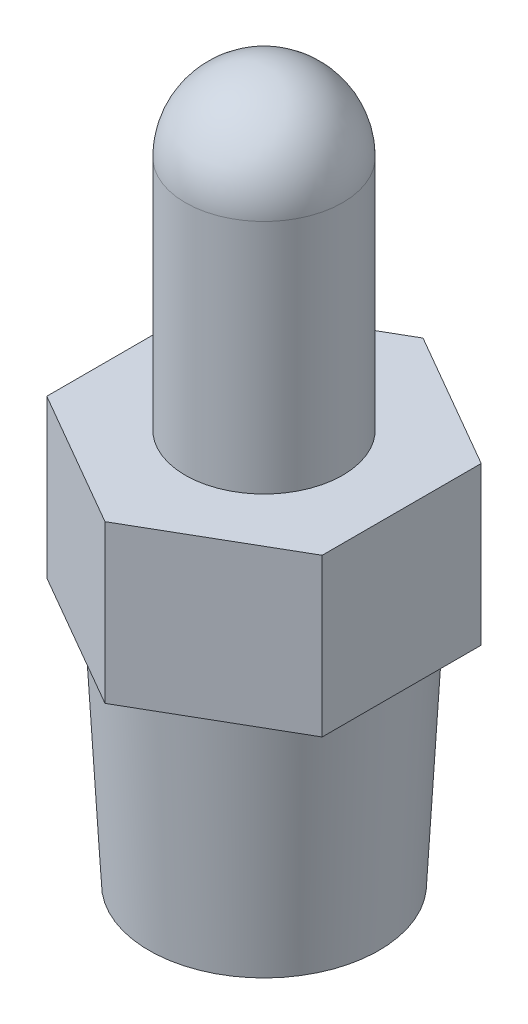
ISO-10303-21;
HEADER;
FILE_DESCRIPTION(('STEP AP214'),'2;1');
FILE_NAME('part.step','',(''),(''),'','','');
FILE_SCHEMA(('AUTOMOTIVE_DESIGN { 1 0 10303 214 1 1 1 1 }'));
ENDSEC;
DATA;
#1=APPLICATION_CONTEXT('core data for automotive mechanical design processes');
#2=APPLICATION_PROTOCOL_DEFINITION('international standard','automotive_design',2000,#1);
#3=PRODUCT_CONTEXT('',#1,'mechanical');
#4=PRODUCT('Part','Part','',(#3));
#5=PRODUCT_RELATED_PRODUCT_CATEGORY('part','',(#4));
#6=PRODUCT_DEFINITION_FORMATION('','',#4);
#7=PRODUCT_DEFINITION_CONTEXT('part definition',#1,'design');
#8=PRODUCT_DEFINITION('design','',#6,#7);
#9=PRODUCT_DEFINITION_SHAPE('','',#8);
#10=(LENGTH_UNIT() NAMED_UNIT(*) SI_UNIT(.MILLI.,.METRE.));
#11=(NAMED_UNIT(*) PLANE_ANGLE_UNIT() SI_UNIT($,.RADIAN.));
#12=(NAMED_UNIT(*) SI_UNIT($,.STERADIAN.) SOLID_ANGLE_UNIT());
#13=UNCERTAINTY_MEASURE_WITH_UNIT(LENGTH_MEASURE(1.E-05),#10,'distance_accuracy_value','');
#14=(GEOMETRIC_REPRESENTATION_CONTEXT(3) GLOBAL_UNCERTAINTY_ASSIGNED_CONTEXT((#13)) GLOBAL_UNIT_ASSIGNED_CONTEXT((#10,
#11,#12)) REPRESENTATION_CONTEXT('',''));
#15=CARTESIAN_POINT('',(0.,0.,0.));
#16=DIRECTION('',(0.,0.,1.));
#17=DIRECTION('',(1.,0.,0.));
#18=AXIS2_PLACEMENT_3D('',#15,#16,#17);
#19=CARTESIAN_POINT('',(5.55625,6.35,3.20790243318486));
#20=DIRECTION('',(-1.,0.,0.));
#21=DIRECTION('',(0.,0.,1.));
#22=AXIS2_PLACEMENT_3D('',#19,#20,#21);
#23=PLANE('',#22);
#24=DIRECTION('',(0.,0.,-1.));
#25=VECTOR('',#24,1.);
#26=CARTESIAN_POINT('',(5.55625,0.,3.20790243318486));
#27=LINE('',#26,#25);
#28=CARTESIAN_POINT('',(5.55625,0.,3.20790243318486));
#29=VERTEX_POINT('',#28);
#30=CARTESIAN_POINT('',(5.55625,0.,-3.20790243318486));
#31=VERTEX_POINT('',#30);
#32=EDGE_CURVE('E119',#29,#31,#27,.T.);
#33=ORIENTED_EDGE('',*,*,#32,.T.);
#34=DIRECTION('',(0.,-1.,0.));
#35=VECTOR('',#34,1.);
#36=CARTESIAN_POINT('',(5.55625,6.35,-3.20790243318486));
#37=LINE('',#36,#35);
#38=CARTESIAN_POINT('',(5.55625,6.35,-3.20790243318486));
#39=VERTEX_POINT('',#38);
#40=EDGE_CURVE('E137',#39,#31,#37,.T.);
#41=ORIENTED_EDGE('',*,*,#40,.F.);
#42=DIRECTION('',(0.,0.,-1.));
#43=VECTOR('',#42,1.);
#44=CARTESIAN_POINT('',(5.55625,6.35,3.20790243318486));
#45=LINE('',#44,#43);
#46=CARTESIAN_POINT('',(5.55625,6.35,3.20790243318486));
#47=VERTEX_POINT('',#46);
#48=EDGE_CURVE('E130',#47,#39,#45,.T.);
#49=ORIENTED_EDGE('',*,*,#48,.F.);
#50=DIRECTION('',(0.,-1.,0.));
#51=VECTOR('',#50,1.);
#52=CARTESIAN_POINT('',(5.55625,6.35,3.20790243318486));
#53=LINE('',#52,#51);
#54=EDGE_CURVE('E115',#47,#29,#53,.T.);
#55=ORIENTED_EDGE('',*,*,#54,.T.);
#56=EDGE_LOOP('',(#33,#41,#49,#55));
#57=FACE_BOUND('',#56,.T.);
#58=ADVANCED_FACE('F33',(#57),#23,.F.);
#59=CARTESIAN_POINT('',(5.55625,6.35,-3.20790243318486));
#60=DIRECTION('',(-0.5,0.,0.866025403784439));
#61=DIRECTION('',(0.866025403784439,0.,0.5));
#62=AXIS2_PLACEMENT_3D('',#59,#60,#61);
#63=PLANE('',#62);
#64=DIRECTION('',(-0.866025403784439,0.,-0.5));
#65=VECTOR('',#64,1.);
#66=CARTESIAN_POINT('',(5.55625,0.,-3.20790243318486));
#67=LINE('',#66,#65);
#68=CARTESIAN_POINT('',(0.,0.,-6.41580486636972));
#69=VERTEX_POINT('',#68);
#70=EDGE_CURVE('E122',#31,#69,#67,.T.);
#71=ORIENTED_EDGE('',*,*,#70,.T.);
#72=DIRECTION('',(0.,-1.,0.));
#73=VECTOR('',#72,1.);
#74=CARTESIAN_POINT('',(0.,6.35,-6.41580486636972));
#75=LINE('',#74,#73);
#76=CARTESIAN_POINT('',(0.,6.35,-6.41580486636972));
#77=VERTEX_POINT('',#76);
#78=EDGE_CURVE('E134',#77,#69,#75,.T.);
#79=ORIENTED_EDGE('',*,*,#78,.F.);
#80=DIRECTION('',(-0.866025403784439,0.,-0.5));
#81=VECTOR('',#80,1.);
#82=CARTESIAN_POINT('',(5.55625,6.35,-3.20790243318486));
#83=LINE('',#82,#81);
#84=EDGE_CURVE('E88',#39,#77,#83,.T.);
#85=ORIENTED_EDGE('',*,*,#84,.F.);
#86=ORIENTED_EDGE('',*,*,#40,.T.);
#87=EDGE_LOOP('',(#71,#79,#85,#86));
#88=FACE_BOUND('',#87,.T.);
#89=ADVANCED_FACE('F156',(#88),#63,.F.);
#90=CARTESIAN_POINT('',(0.,6.35,-6.41580486636972));
#91=DIRECTION('',(0.5,0.,0.866025403784439));
#92=DIRECTION('',(0.866025403784439,0.,-0.5));
#93=AXIS2_PLACEMENT_3D('',#90,#91,#92);
#94=PLANE('',#93);
#95=DIRECTION('',(-0.866025403784439,0.,0.5));
#96=VECTOR('',#95,1.);
#97=CARTESIAN_POINT('',(0.,0.,-6.41580486636972));
#98=LINE('',#97,#96);
#99=CARTESIAN_POINT('',(-5.55625,0.,-3.20790243318486));
#100=VERTEX_POINT('',#99);
#101=EDGE_CURVE('E125',#69,#100,#98,.T.);
#102=ORIENTED_EDGE('',*,*,#101,.T.);
#103=DIRECTION('',(0.,-1.,0.));
#104=VECTOR('',#103,1.);
#105=CARTESIAN_POINT('',(-5.55625,6.35,-3.20790243318486));
#106=LINE('',#105,#104);
#107=CARTESIAN_POINT('',(-5.55625,6.35,-3.20790243318486));
#108=VERTEX_POINT('',#107);
#109=EDGE_CURVE('E110',#108,#100,#106,.T.);
#110=ORIENTED_EDGE('',*,*,#109,.F.);
#111=DIRECTION('',(-0.866025403784439,0.,0.5));
#112=VECTOR('',#111,1.);
#113=CARTESIAN_POINT('',(0.,6.35,-6.41580486636972));
#114=LINE('',#113,#112);
#115=EDGE_CURVE('E101',#77,#108,#114,.T.);
#116=ORIENTED_EDGE('',*,*,#115,.F.);
#117=ORIENTED_EDGE('',*,*,#78,.T.);
#118=EDGE_LOOP('',(#102,#110,#116,#117));
#119=FACE_BOUND('',#118,.T.);
#120=ADVANCED_FACE('F161',(#119),#94,.F.);
#121=CARTESIAN_POINT('',(-5.55625,6.35,-3.20790243318486));
#122=DIRECTION('',(1.,0.,0.));
#123=DIRECTION('',(0.,0.,-1.));
#124=AXIS2_PLACEMENT_3D('',#121,#122,#123);
#125=PLANE('',#124);
#126=DIRECTION('',(0.,0.,1.));
#127=VECTOR('',#126,1.);
#128=CARTESIAN_POINT('',(-5.55625,0.,-3.20790243318486));
#129=LINE('',#128,#127);
#130=CARTESIAN_POINT('',(-5.55625,0.,3.20790243318486));
#131=VERTEX_POINT('',#130);
#132=EDGE_CURVE('E109',#100,#131,#129,.T.);
#133=ORIENTED_EDGE('',*,*,#132,.T.);
#134=DIRECTION('',(0.,-1.,0.));
#135=VECTOR('',#134,1.);
#136=CARTESIAN_POINT('',(-5.55625,6.35,3.20790243318486));
#137=LINE('',#136,#135);
#138=CARTESIAN_POINT('',(-5.55625,6.35,3.20790243318486));
#139=VERTEX_POINT('',#138);
#140=EDGE_CURVE('E106',#139,#131,#137,.T.);
#141=ORIENTED_EDGE('',*,*,#140,.F.);
#142=DIRECTION('',(0.,0.,1.));
#143=VECTOR('',#142,1.);
#144=CARTESIAN_POINT('',(-5.55625,6.35,-3.20790243318486));
#145=LINE('',#144,#143);
#146=EDGE_CURVE('E95',#108,#139,#145,.T.);
#147=ORIENTED_EDGE('',*,*,#146,.F.);
#148=ORIENTED_EDGE('',*,*,#109,.T.);
#149=EDGE_LOOP('',(#133,#141,#147,#148));
#150=FACE_BOUND('',#149,.T.);
#151=ADVANCED_FACE('F107',(#150),#125,.F.);
#152=CARTESIAN_POINT('',(-5.55625,6.35,3.20790243318486));
#153=DIRECTION('',(0.5,0.,-0.866025403784439));
#154=DIRECTION('',(-0.866025403784439,0.,-0.5));
#155=AXIS2_PLACEMENT_3D('',#152,#153,#154);
#156=PLANE('',#155);
#157=DIRECTION('',(0.866025403784439,0.,0.5));
#158=VECTOR('',#157,1.);
#159=CARTESIAN_POINT('',(-5.55625,0.,3.20790243318486));
#160=LINE('',#159,#158);
#161=CARTESIAN_POINT('',(0.,0.,6.41580486636972));
#162=VERTEX_POINT('',#161);
#163=EDGE_CURVE('E73',#131,#162,#160,.T.);
#164=ORIENTED_EDGE('',*,*,#163,.T.);
#165=DIRECTION('',(0.,-1.,0.));
#166=VECTOR('',#165,1.);
#167=CARTESIAN_POINT('',(0.,6.35,6.41580486636972));
#168=LINE('',#167,#166);
#169=CARTESIAN_POINT('',(0.,6.35,6.41580486636972));
#170=VERTEX_POINT('',#169);
#171=EDGE_CURVE('E111',#170,#162,#168,.T.);
#172=ORIENTED_EDGE('',*,*,#171,.F.);
#173=DIRECTION('',(0.866025403784439,0.,0.5));
#174=VECTOR('',#173,1.);
#175=CARTESIAN_POINT('',(-5.55625,6.35,3.20790243318486));
#176=LINE('',#175,#174);
#177=EDGE_CURVE('E99',#139,#170,#176,.T.);
#178=ORIENTED_EDGE('',*,*,#177,.F.);
#179=ORIENTED_EDGE('',*,*,#140,.T.);
#180=EDGE_LOOP('',(#164,#172,#178,#179));
#181=FACE_BOUND('',#180,.T.);
#182=ADVANCED_FACE('F113',(#181),#156,.F.);
#183=CARTESIAN_POINT('',(0.,6.35,6.41580486636972));
#184=DIRECTION('',(-0.5,0.,-0.866025403784438));
#185=DIRECTION('',(-0.866025403784439,0.,0.5));
#186=AXIS2_PLACEMENT_3D('',#183,#184,#185);
#187=PLANE('',#186);
#188=DIRECTION('',(0.866025403784438,0.,-0.5));
#189=VECTOR('',#188,1.);
#190=CARTESIAN_POINT('',(0.,0.,6.41580486636972));
#191=LINE('',#190,#189);
#192=EDGE_CURVE('E79',#162,#29,#191,.T.);
#193=ORIENTED_EDGE('',*,*,#192,.T.);
#194=ORIENTED_EDGE('',*,*,#54,.F.);
#195=DIRECTION('',(0.866025403784438,0.,-0.5));
#196=VECTOR('',#195,1.);
#197=CARTESIAN_POINT('',(0.,6.35,6.41580486636972));
#198=LINE('',#197,#196);
#199=EDGE_CURVE('E50',#170,#47,#198,.T.);
#200=ORIENTED_EDGE('',*,*,#199,.F.);
#201=ORIENTED_EDGE('',*,*,#171,.T.);
#202=EDGE_LOOP('',(#193,#194,#200,#201));
#203=FACE_BOUND('',#202,.T.);
#204=ADVANCED_FACE('F171',(#203),#187,.F.);
#205=CARTESIAN_POINT('',(0.,6.35,0.));
#206=DIRECTION('',(0.,1.,0.));
#207=DIRECTION('',(0.,0.,1.));
#208=AXIS2_PLACEMENT_3D('',#205,#206,#207);
#209=PLANE('',#208);
#210=CARTESIAN_POINT('',(0.,6.35,0.));
#211=DIRECTION('',(0.,1.,0.));
#212=DIRECTION('',(0.,0.,1.));
#213=AXIS2_PLACEMENT_3D('',#210,#211,#212);
#214=CIRCLE('',#213,3.175);
#215=CARTESIAN_POINT('',(0.,6.35,3.175));
#216=VERTEX_POINT('',#215);
#217=EDGE_CURVE('E123',#216,#216,#214,.T.);
#218=ORIENTED_EDGE('',*,*,#217,.F.);
#219=EDGE_LOOP('',(#218));
#220=FACE_BOUND('',#219,.T.);
#221=ORIENTED_EDGE('',*,*,#48,.T.);
#222=ORIENTED_EDGE('',*,*,#84,.T.);
#223=ORIENTED_EDGE('',*,*,#115,.T.);
#224=ORIENTED_EDGE('',*,*,#146,.T.);
#225=ORIENTED_EDGE('',*,*,#177,.T.);
#226=ORIENTED_EDGE('',*,*,#199,.T.);
#227=EDGE_LOOP('',(#221,#222,#223,#224,#225,#226));
#228=FACE_BOUND('',#227,.T.);
#229=ADVANCED_FACE('F97',(#220,#228),#209,.T.);
#230=CARTESIAN_POINT('',(0.,0.,0.));
#231=DIRECTION('',(0.,1.,0.));
#232=DIRECTION('',(0.,0.,1.));
#233=AXIS2_PLACEMENT_3D('',#230,#231,#232);
#234=PLANE('',#233);
#235=CARTESIAN_POINT('',(0.,0.,0.));
#236=DIRECTION('',(0.,1.,0.));
#237=DIRECTION('',(0.,0.,1.));
#238=AXIS2_PLACEMENT_3D('',#235,#236,#237);
#239=CIRCLE('',#238,5.13675364126955);
#240=CARTESIAN_POINT('',(0.,0.,5.13675364126955));
#241=VERTEX_POINT('',#240);
#242=EDGE_CURVE('E11',#241,#241,#239,.F.);
#243=ORIENTED_EDGE('',*,*,#242,.F.);
#244=EDGE_LOOP('',(#243));
#245=FACE_BOUND('',#244,.T.);
#246=ORIENTED_EDGE('',*,*,#32,.F.);
#247=ORIENTED_EDGE('',*,*,#192,.F.);
#248=ORIENTED_EDGE('',*,*,#163,.F.);
#249=ORIENTED_EDGE('',*,*,#132,.F.);
#250=ORIENTED_EDGE('',*,*,#101,.F.);
#251=ORIENTED_EDGE('',*,*,#70,.F.);
#252=EDGE_LOOP('',(#246,#247,#248,#249,#250,#251));
#253=FACE_BOUND('',#252,.T.);
#254=ADVANCED_FACE('F153',(#245,#253),#234,.F.);
#255=CARTESIAN_POINT('',(0.,19.05,0.));
#256=DIRECTION('',(0.,-1.,0.));
#257=DIRECTION('',(0.,0.,-1.));
#258=AXIS2_PLACEMENT_3D('',#255,#256,#257);
#259=CYLINDRICAL_SURFACE('',#258,3.175);
#260=CARTESIAN_POINT('',(0.,15.875,0.));
#261=DIRECTION('',(0.,-1.,0.));
#262=DIRECTION('',(0.,0.,-1.));
#263=AXIS2_PLACEMENT_3D('',#260,#261,#262);
#264=CIRCLE('',#263,3.175);
#265=CARTESIAN_POINT('',(0.,15.875,-3.175));
#266=VERTEX_POINT('',#265);
#267=EDGE_CURVE('E42',#266,#266,#264,.T.);
#268=ORIENTED_EDGE('',*,*,#267,.T.);
#269=EDGE_LOOP('',(#268));
#270=FACE_BOUND('',#269,.T.);
#271=ORIENTED_EDGE('',*,*,#217,.T.);
#272=EDGE_LOOP('',(#271));
#273=FACE_BOUND('',#272,.T.);
#274=ADVANCED_FACE('F141',(#270,#273),#259,.T.);
#275=CARTESIAN_POINT('',(0.,15.875,0.));
#276=DIRECTION('',(0.,1.,0.));
#277=DIRECTION('',(0.,0.,1.));
#278=AXIS2_PLACEMENT_3D('',#275,#276,#277);
#279=SPHERICAL_SURFACE('',#278,3.175);
#280=ORIENTED_EDGE('',*,*,#267,.F.);
#281=EDGE_LOOP('',(#280));
#282=FACE_BOUND('',#281,.T.);
#283=ADVANCED_FACE('F35',(#282),#279,.T.);
#284=CARTESIAN_POINT('',(0.,0.,0.));
#285=DIRECTION('',(0.,1.,0.));
#286=DIRECTION('',(0.,0.,-1.));
#287=AXIS2_PLACEMENT_3D('',#284,#285,#286);
#288=CONICAL_SURFACE('',#287,5.13675364126955,0.0523598775598299);
#289=CARTESIAN_POINT('',(0.,-9.525,0.));
#290=DIRECTION('',(0.,-1.,0.));
#291=DIRECTION('',(0.,0.,-1.));
#292=AXIS2_PLACEMENT_3D('',#289,#290,#291);
#293=CIRCLE('',#292,4.63756954359859);
#294=CARTESIAN_POINT('',(0.,-9.525,-4.63756954359859));
#295=VERTEX_POINT('',#294);
#296=EDGE_CURVE('E186',#295,#295,#293,.T.);
#297=ORIENTED_EDGE('',*,*,#296,.F.);
#298=EDGE_LOOP('',(#297));
#299=FACE_BOUND('',#298,.T.);
#300=ORIENTED_EDGE('',*,*,#242,.T.);
#301=EDGE_LOOP('',(#300));
#302=FACE_BOUND('',#301,.T.);
#303=ADVANCED_FACE('F145',(#299,#302),#288,.T.);
#304=CARTESIAN_POINT('',(0.,-9.525,0.));
#305=DIRECTION('',(0.,-1.,0.));
#306=DIRECTION('',(0.,0.,-1.));
#307=AXIS2_PLACEMENT_3D('',#304,#305,#306);
#308=PLANE('',#307);
#309=ORIENTED_EDGE('',*,*,#296,.T.);
#310=EDGE_LOOP('',(#309));
#311=FACE_BOUND('',#310,.T.);
#312=ADVANCED_FACE('F150',(#311),#308,.T.);
#313=CLOSED_SHELL('',(#58,#89,#120,#151,#182,#204,#229,#254,#274,#283,#303,#312));
#314=MANIFOLD_SOLID_BREP('B2',#313);
#315=ADVANCED_BREP_SHAPE_REPRESENTATION('',(#18,#314),#14);
#316=SHAPE_DEFINITION_REPRESENTATION(#9,#315);
ENDSEC;
END-ISO-10303-21;
